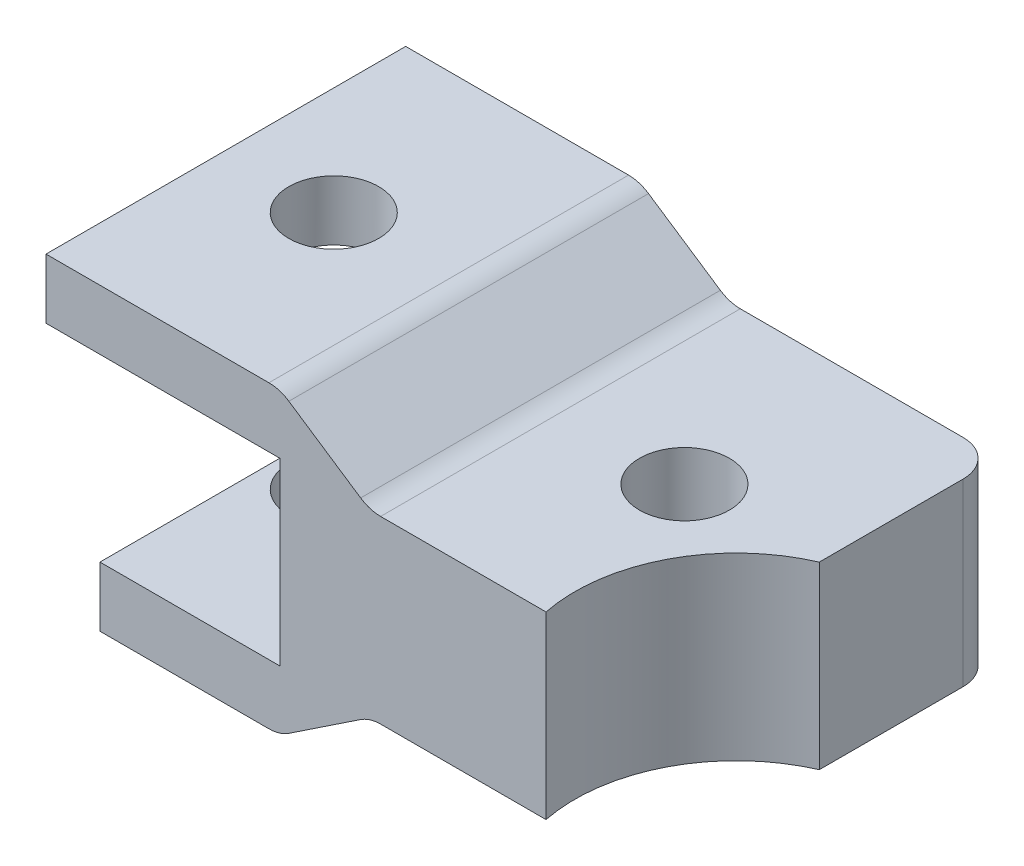
ISO-10303-21;
HEADER;
FILE_DESCRIPTION(('STEP AP214'),'2;1');
FILE_NAME('part.step','',(''),(''),'','','');
FILE_SCHEMA(('AUTOMOTIVE_DESIGN { 1 0 10303 214 1 1 1 1 }'));
ENDSEC;
DATA;
#1=APPLICATION_CONTEXT('core data for automotive mechanical design processes');
#2=APPLICATION_PROTOCOL_DEFINITION('international standard','automotive_design',2000,#1);
#3=PRODUCT_CONTEXT('',#1,'mechanical');
#4=PRODUCT('Part','Part','',(#3));
#5=PRODUCT_RELATED_PRODUCT_CATEGORY('part','',(#4));
#6=PRODUCT_DEFINITION_FORMATION('','',#4);
#7=PRODUCT_DEFINITION_CONTEXT('part definition',#1,'design');
#8=PRODUCT_DEFINITION('design','',#6,#7);
#9=PRODUCT_DEFINITION_SHAPE('','',#8);
#10=(LENGTH_UNIT() NAMED_UNIT(*) SI_UNIT(.MILLI.,.METRE.));
#11=(NAMED_UNIT(*) PLANE_ANGLE_UNIT() SI_UNIT($,.RADIAN.));
#12=(NAMED_UNIT(*) SI_UNIT($,.STERADIAN.) SOLID_ANGLE_UNIT());
#13=UNCERTAINTY_MEASURE_WITH_UNIT(LENGTH_MEASURE(1.E-05),#10,'distance_accuracy_value','');
#14=(GEOMETRIC_REPRESENTATION_CONTEXT(3) GLOBAL_UNCERTAINTY_ASSIGNED_CONTEXT((#13)) GLOBAL_UNIT_ASSIGNED_CONTEXT((#10,
#11,#12)) REPRESENTATION_CONTEXT('',''));
#15=CARTESIAN_POINT('',(0.,0.,0.));
#16=DIRECTION('',(0.,0.,1.));
#17=DIRECTION('',(1.,0.,0.));
#18=AXIS2_PLACEMENT_3D('',#15,#16,#17);
#19=CARTESIAN_POINT('',(5.85829192129549,-8.79095426364869,25.4));
#20=DIRECTION('',(-0.554546558579448,0.832152698948751,0.));
#21=DIRECTION('',(-0.832152698948751,-0.554546558579448,0.));
#22=AXIS2_PLACEMENT_3D('',#19,#20,#21);
#23=PLANE('',#22);
#24=DIRECTION('',(0.832152698948751,0.554546558579448,0.));
#25=VECTOR('',#24,1.);
#26=CARTESIAN_POINT('',(5.85829192129549,-8.79095426364869,0.));
#27=LINE('',#26,#25);
#28=CARTESIAN_POINT('',(13.3397541186527,-3.80530785532983,0.));
#29=VERTEX_POINT('',#28);
#30=CARTESIAN_POINT('',(18.4102458813473,-0.426332144670171,0.));
#31=VERTEX_POINT('',#30);
#32=EDGE_CURVE('E356',#29,#31,#27,.T.);
#33=ORIENTED_EDGE('',*,*,#32,.T.);
#34=DIRECTION('',(0.,0.,-1.));
#35=VECTOR('',#34,1.);
#36=CARTESIAN_POINT('',(18.4102458813473,-0.426332144670173,25.4));
#37=LINE('',#36,#35);
#38=CARTESIAN_POINT('',(18.4102458813473,-0.426332144670171,25.4));
#39=VERTEX_POINT('',#38);
#40=EDGE_CURVE('E297',#31,#39,#37,.F.);
#41=ORIENTED_EDGE('',*,*,#40,.T.);
#42=DIRECTION('',(0.832152698948751,0.554546558579448,0.));
#43=VECTOR('',#42,1.);
#44=CARTESIAN_POINT('',(5.85829192129549,-8.79095426364869,25.4));
#45=LINE('',#44,#43);
#46=CARTESIAN_POINT('',(13.3397541186527,-3.80530785532983,25.4));
#47=VERTEX_POINT('',#46);
#48=EDGE_CURVE('E390',#47,#39,#45,.T.);
#49=ORIENTED_EDGE('',*,*,#48,.F.);
#50=DIRECTION('',(0.,0.,-1.));
#51=VECTOR('',#50,1.);
#52=CARTESIAN_POINT('',(13.3397541186527,-3.80530785532983,25.4));
#53=LINE('',#52,#51);
#54=EDGE_CURVE('E294',#47,#29,#53,.T.);
#55=ORIENTED_EDGE('',*,*,#54,.T.);
#56=EDGE_LOOP('',(#33,#41,#49,#55));
#57=FACE_BOUND('',#56,.T.);
#58=ADVANCED_FACE('F86',(#57),#23,.F.);
#59=CARTESIAN_POINT('',(0.,0.,25.4));
#60=DIRECTION('',(0.,1.,0.));
#61=DIRECTION('',(0.,0.,1.));
#62=AXIS2_PLACEMENT_3D('',#59,#60,#61);
#63=PLANE('',#62);
#64=CARTESIAN_POINT('',(28.575,0.,12.7));
#65=DIRECTION('',(0.,1.,0.));
#66=DIRECTION('',(0.,0.,1.));
#67=AXIS2_PLACEMENT_3D('',#64,#65,#66);
#68=CIRCLE('',#67,3.175);
#69=CARTESIAN_POINT('',(28.575,0.,15.875));
#70=VERTEX_POINT('',#69);
#71=EDGE_CURVE('E276',#70,#70,#68,.T.);
#72=ORIENTED_EDGE('',*,*,#71,.T.);
#73=EDGE_LOOP('',(#72));
#74=FACE_BOUND('',#73,.T.);
#75=DIRECTION('',(1.,0.,0.));
#76=VECTOR('',#75,1.);
#77=CARTESIAN_POINT('',(0.,0.,0.));
#78=LINE('',#77,#76);
#79=CARTESIAN_POINT('',(19.8187941401391,0.,0.));
#80=VERTEX_POINT('',#79);
#81=CARTESIAN_POINT('',(35.56,0.,0.));
#82=VERTEX_POINT('',#81);
#83=EDGE_CURVE('E330',#80,#82,#78,.T.);
#84=ORIENTED_EDGE('',*,*,#83,.T.);
#85=CARTESIAN_POINT('',(35.56,0.,2.54));
#86=DIRECTION('',(0.,1.,0.));
#87=DIRECTION('',(0.,0.,1.));
#88=AXIS2_PLACEMENT_3D('',#85,#86,#87);
#89=CIRCLE('',#88,2.54);
#90=CARTESIAN_POINT('',(38.1,0.,2.54));
#91=VERTEX_POINT('',#90);
#92=EDGE_CURVE('E240',#82,#91,#89,.F.);
#93=ORIENTED_EDGE('',*,*,#92,.T.);
#94=DIRECTION('',(0.,0.,-1.));
#95=VECTOR('',#94,1.);
#96=CARTESIAN_POINT('',(38.1,0.,25.4));
#97=LINE('',#96,#95);
#98=CARTESIAN_POINT('',(38.1,0.,12.7));
#99=VERTEX_POINT('',#98);
#100=EDGE_CURVE('E232',#99,#91,#97,.T.);
#101=ORIENTED_EDGE('',*,*,#100,.F.);
#102=CARTESIAN_POINT('',(42.6728306226393,0.,23.1411593188651));
#103=DIRECTION('',(0.,1.,0.));
#104=DIRECTION('',(0.,0.,1.));
#105=AXIS2_PLACEMENT_3D('',#102,#103,#104);
#106=CIRCLE('',#105,11.3986221897768);
#107=CARTESIAN_POINT('',(31.5002648205274,0.,25.4));
#108=VERTEX_POINT('',#107);
#109=EDGE_CURVE('E213',#99,#108,#106,.T.);
#110=ORIENTED_EDGE('',*,*,#109,.T.);
#111=DIRECTION('',(1.,0.,0.));
#112=VECTOR('',#111,1.);
#113=CARTESIAN_POINT('',(0.,0.,25.4));
#114=LINE('',#113,#112);
#115=CARTESIAN_POINT('',(19.8187941401391,0.,25.4));
#116=VERTEX_POINT('',#115);
#117=EDGE_CURVE('E346',#116,#108,#114,.T.);
#118=ORIENTED_EDGE('',*,*,#117,.F.);
#119=DIRECTION('',(0.,0.,-1.));
#120=VECTOR('',#119,1.);
#121=CARTESIAN_POINT('',(19.8187941401391,0.,0.));
#122=LINE('',#121,#120);
#123=EDGE_CURVE('E290',#116,#80,#122,.T.);
#124=ORIENTED_EDGE('',*,*,#123,.T.);
#125=EDGE_LOOP('',(#84,#93,#101,#110,#118,#124));
#126=FACE_BOUND('',#125,.T.);
#127=ADVANCED_FACE('F238',(#74,#126),#63,.F.);
#128=CARTESIAN_POINT('',(38.1,0.,25.4));
#129=DIRECTION('',(-1.,0.,0.));
#130=DIRECTION('',(0.,0.,1.));
#131=AXIS2_PLACEMENT_3D('',#128,#129,#130);
#132=PLANE('',#131);
#133=ORIENTED_EDGE('',*,*,#100,.T.);
#134=DIRECTION('',(0.,1.,0.));
#135=VECTOR('',#134,1.);
#136=CARTESIAN_POINT('',(38.1,0.,2.54));
#137=LINE('',#136,#135);
#138=CARTESIAN_POINT('',(38.1,12.7,2.54));
#139=VERTEX_POINT('',#138);
#140=EDGE_CURVE('E278',#91,#139,#137,.T.);
#141=ORIENTED_EDGE('',*,*,#140,.T.);
#142=DIRECTION('',(0.,0.,-1.));
#143=VECTOR('',#142,1.);
#144=CARTESIAN_POINT('',(38.1,12.7,25.4));
#145=LINE('',#144,#143);
#146=CARTESIAN_POINT('',(38.1,12.7,12.7));
#147=VERTEX_POINT('',#146);
#148=EDGE_CURVE('E235',#147,#139,#145,.T.);
#149=ORIENTED_EDGE('',*,*,#148,.F.);
#150=DIRECTION('',(0.,1.,0.));
#151=VECTOR('',#150,1.);
#152=CARTESIAN_POINT('',(38.1,-4.23164,12.7));
#153=LINE('',#152,#151);
#154=EDGE_CURVE('E217',#99,#147,#153,.T.);
#155=ORIENTED_EDGE('',*,*,#154,.F.);
#156=EDGE_LOOP('',(#133,#141,#149,#155));
#157=FACE_BOUND('',#156,.T.);
#158=ADVANCED_FACE('F230',(#157),#132,.F.);
#159=CARTESIAN_POINT('',(0.,12.7,25.4));
#160=DIRECTION('',(0.,1.,0.));
#161=DIRECTION('',(0.,0.,1.));
#162=AXIS2_PLACEMENT_3D('',#159,#160,#161);
#163=PLANE('',#162);
#164=ORIENTED_EDGE('',*,*,#148,.T.);
#165=CARTESIAN_POINT('',(35.56,12.7,2.54));
#166=DIRECTION('',(0.,1.,0.));
#167=DIRECTION('',(0.,0.,1.));
#168=AXIS2_PLACEMENT_3D('',#165,#166,#167);
#169=CIRCLE('',#168,2.54);
#170=CARTESIAN_POINT('',(35.56,12.7,0.));
#171=VERTEX_POINT('',#170);
#172=EDGE_CURVE('E282',#139,#171,#169,.T.);
#173=ORIENTED_EDGE('',*,*,#172,.T.);
#174=DIRECTION('',(1.,0.,0.));
#175=VECTOR('',#174,1.);
#176=CARTESIAN_POINT('',(0.,12.7,0.));
#177=LINE('',#176,#175);
#178=CARTESIAN_POINT('',(19.8187941401391,12.7,0.));
#179=VERTEX_POINT('',#178);
#180=EDGE_CURVE('E319',#179,#171,#177,.T.);
#181=ORIENTED_EDGE('',*,*,#180,.F.);
#182=DIRECTION('',(0.,0.,-1.));
#183=VECTOR('',#182,1.);
#184=CARTESIAN_POINT('',(19.8187941401391,12.7,25.4));
#185=LINE('',#184,#183);
#186=CARTESIAN_POINT('',(19.8187941401391,12.7,25.4));
#187=VERTEX_POINT('',#186);
#188=EDGE_CURVE('E280',#179,#187,#185,.F.);
#189=ORIENTED_EDGE('',*,*,#188,.T.);
#190=DIRECTION('',(1.,0.,0.));
#191=VECTOR('',#190,1.);
#192=CARTESIAN_POINT('',(0.,12.7,25.4));
#193=LINE('',#192,#191);
#194=CARTESIAN_POINT('',(31.5002648205274,12.7,25.4));
#195=VERTEX_POINT('',#194);
#196=EDGE_CURVE('E337',#187,#195,#193,.T.);
#197=ORIENTED_EDGE('',*,*,#196,.T.);
#198=CARTESIAN_POINT('',(42.6728306226393,12.7,23.1411593188651));
#199=DIRECTION('',(0.,1.,0.));
#200=DIRECTION('',(0.,0.,1.));
#201=AXIS2_PLACEMENT_3D('',#198,#199,#200);
#202=CIRCLE('',#201,11.3986221897768);
#203=EDGE_CURVE('E225',#147,#195,#202,.T.);
#204=ORIENTED_EDGE('',*,*,#203,.F.);
#205=EDGE_LOOP('',(#164,#173,#181,#189,#197,#204));
#206=FACE_BOUND('',#205,.T.);
#207=CARTESIAN_POINT('',(28.575,12.7,12.7));
#208=DIRECTION('',(0.,1.,0.));
#209=DIRECTION('',(0.,0.,1.));
#210=AXIS2_PLACEMENT_3D('',#207,#208,#209);
#211=CIRCLE('',#210,3.175);
#212=CARTESIAN_POINT('',(28.575,12.7,15.875));
#213=VERTEX_POINT('',#212);
#214=EDGE_CURVE('E224',#213,#213,#211,.T.);
#215=ORIENTED_EDGE('',*,*,#214,.F.);
#216=EDGE_LOOP('',(#215));
#217=FACE_BOUND('',#216,.T.);
#218=ADVANCED_FACE('F327',(#206,#217),#163,.T.);
#219=CARTESIAN_POINT('',(11.7189280970613,17.5854263161184,25.4));
#220=DIRECTION('',(0.554546558579448,0.832152698948751,0.));
#221=DIRECTION('',(-0.832152698948751,0.554546558579448,0.));
#222=AXIS2_PLACEMENT_3D('',#219,#220,#221);
#223=PLANE('',#222);
#224=DIRECTION('',(0.832152698948751,-0.554546558579448,0.));
#225=VECTOR('',#224,1.);
#226=CARTESIAN_POINT('',(11.7189280970613,17.5854263161184,25.4));
#227=LINE('',#226,#225);
#228=CARTESIAN_POINT('',(13.3397541186527,16.5053078553298,25.4));
#229=VERTEX_POINT('',#228);
#230=CARTESIAN_POINT('',(18.4102458813473,13.1263321446702,25.4));
#231=VERTEX_POINT('',#230);
#232=EDGE_CURVE('E336',#229,#231,#227,.T.);
#233=ORIENTED_EDGE('',*,*,#232,.T.);
#234=DIRECTION('',(0.,0.,-1.));
#235=VECTOR('',#234,1.);
#236=CARTESIAN_POINT('',(18.4102458813473,13.1263321446702,0.));
#237=LINE('',#236,#235);
#238=CARTESIAN_POINT('',(18.4102458813473,13.1263321446702,0.));
#239=VERTEX_POINT('',#238);
#240=EDGE_CURVE('E301',#231,#239,#237,.T.);
#241=ORIENTED_EDGE('',*,*,#240,.T.);
#242=DIRECTION('',(0.832152698948751,-0.554546558579448,0.));
#243=VECTOR('',#242,1.);
#244=CARTESIAN_POINT('',(11.7189280970613,17.5854263161184,0.));
#245=LINE('',#244,#243);
#246=CARTESIAN_POINT('',(13.3397541186527,16.5053078553298,0.));
#247=VERTEX_POINT('',#246);
#248=EDGE_CURVE('E322',#247,#239,#245,.T.);
#249=ORIENTED_EDGE('',*,*,#248,.F.);
#250=DIRECTION('',(0.,0.,-1.));
#251=VECTOR('',#250,1.);
#252=CARTESIAN_POINT('',(13.3397541186527,16.5053078553298,25.4));
#253=LINE('',#252,#251);
#254=EDGE_CURVE('E299',#247,#229,#253,.F.);
#255=ORIENTED_EDGE('',*,*,#254,.T.);
#256=EDGE_LOOP('',(#233,#241,#249,#255));
#257=FACE_BOUND('',#256,.T.);
#258=ADVANCED_FACE('F339',(#257),#223,.T.);
#259=CARTESIAN_POINT('',(12.7,0.,25.4));
#260=DIRECTION('',(-1.,0.,0.));
#261=DIRECTION('',(0.,0.,1.));
#262=AXIS2_PLACEMENT_3D('',#259,#260,#261);
#263=PLANE('',#262);
#264=DIRECTION('',(0.,0.,1.));
#265=VECTOR('',#264,1.);
#266=CARTESIAN_POINT('',(12.7,12.7,25.4));
#267=LINE('',#266,#265);
#268=CARTESIAN_POINT('',(12.7,12.7,0.));
#269=VERTEX_POINT('',#268);
#270=CARTESIAN_POINT('',(12.7,12.7,25.4));
#271=VERTEX_POINT('',#270);
#272=EDGE_CURVE('E241',#269,#271,#267,.T.);
#273=ORIENTED_EDGE('',*,*,#272,.F.);
#274=DIRECTION('',(0.,1.,0.));
#275=VECTOR('',#274,1.);
#276=CARTESIAN_POINT('',(12.7,0.,0.));
#277=LINE('',#276,#275);
#278=CARTESIAN_POINT('',(12.7,0.,0.));
#279=VERTEX_POINT('',#278);
#280=EDGE_CURVE('E361',#279,#269,#277,.T.);
#281=ORIENTED_EDGE('',*,*,#280,.F.);
#282=DIRECTION('',(0.,0.,-1.));
#283=VECTOR('',#282,1.);
#284=CARTESIAN_POINT('',(12.7,0.,25.4));
#285=LINE('',#284,#283);
#286=CARTESIAN_POINT('',(12.7,0.,25.4));
#287=VERTEX_POINT('',#286);
#288=EDGE_CURVE('E244',#287,#279,#285,.T.);
#289=ORIENTED_EDGE('',*,*,#288,.F.);
#290=DIRECTION('',(0.,1.,0.));
#291=VECTOR('',#290,1.);
#292=CARTESIAN_POINT('',(12.7,0.,25.4));
#293=LINE('',#292,#291);
#294=EDGE_CURVE('E341',#287,#271,#293,.T.);
#295=ORIENTED_EDGE('',*,*,#294,.T.);
#296=EDGE_LOOP('',(#273,#281,#289,#295));
#297=FACE_BOUND('',#296,.T.);
#298=ADVANCED_FACE('F380',(#297),#263,.T.);
#299=CARTESIAN_POINT('',(0.,0.,25.4));
#300=DIRECTION('',(0.,1.,0.));
#301=DIRECTION('',(0.,0.,1.));
#302=AXIS2_PLACEMENT_3D('',#299,#300,#301);
#303=PLANE('',#302);
#304=CARTESIAN_POINT('',(3.8099999999996,0.,12.7000000000001));
#305=DIRECTION('',(0.,1.,0.));
#306=DIRECTION('',(0.,0.,1.));
#307=AXIS2_PLACEMENT_3D('',#304,#305,#306);
#308=CIRCLE('',#307,3.175);
#309=CARTESIAN_POINT('',(3.8099999999996,0.,15.8750000000001));
#310=VERTEX_POINT('',#309);
#311=EDGE_CURVE('E261',#310,#310,#308,.T.);
#312=ORIENTED_EDGE('',*,*,#311,.F.);
#313=EDGE_LOOP('',(#312));
#314=FACE_BOUND('',#313,.T.);
#315=DIRECTION('',(1.,0.,0.));
#316=VECTOR('',#315,1.);
#317=CARTESIAN_POINT('',(0.,0.,0.));
#318=LINE('',#317,#316);
#319=CARTESIAN_POINT('',(0.,0.,0.));
#320=VERTEX_POINT('',#319);
#321=EDGE_CURVE('E364',#320,#279,#318,.T.);
#322=ORIENTED_EDGE('',*,*,#321,.F.);
#323=DIRECTION('',(0.,0.,-1.));
#324=VECTOR('',#323,1.);
#325=CARTESIAN_POINT('',(0.,0.,25.4));
#326=LINE('',#325,#324);
#327=CARTESIAN_POINT('',(0.,0.,25.4));
#328=VERTEX_POINT('',#327);
#329=EDGE_CURVE('E372',#328,#320,#326,.T.);
#330=ORIENTED_EDGE('',*,*,#329,.F.);
#331=DIRECTION('',(1.,0.,0.));
#332=VECTOR('',#331,1.);
#333=CARTESIAN_POINT('',(0.,0.,25.4));
#334=LINE('',#333,#332);
#335=EDGE_CURVE('E344',#328,#287,#334,.T.);
#336=ORIENTED_EDGE('',*,*,#335,.T.);
#337=ORIENTED_EDGE('',*,*,#288,.T.);
#338=EDGE_LOOP('',(#322,#330,#336,#337));
#339=FACE_BOUND('',#338,.T.);
#340=ADVANCED_FACE('F376',(#314,#339),#303,.T.);
#341=CARTESIAN_POINT('',(0.,0.,25.4));
#342=DIRECTION('',(1.,0.,0.));
#343=DIRECTION('',(0.,0.,-1.));
#344=AXIS2_PLACEMENT_3D('',#341,#342,#343);
#345=PLANE('',#344);
#346=DIRECTION('',(0.,-1.,0.));
#347=VECTOR('',#346,1.);
#348=CARTESIAN_POINT('',(0.,0.,0.));
#349=LINE('',#348,#347);
#350=CARTESIAN_POINT('',(0.,-4.23164,0.));
#351=VERTEX_POINT('',#350);
#352=EDGE_CURVE('E367',#320,#351,#349,.T.);
#353=ORIENTED_EDGE('',*,*,#352,.T.);
#354=DIRECTION('',(0.,0.,-1.));
#355=VECTOR('',#354,1.);
#356=CARTESIAN_POINT('',(0.,-4.23164,25.4));
#357=LINE('',#356,#355);
#358=CARTESIAN_POINT('',(0.,-4.23164,25.4));
#359=VERTEX_POINT('',#358);
#360=EDGE_CURVE('E354',#359,#351,#357,.T.);
#361=ORIENTED_EDGE('',*,*,#360,.F.);
#362=DIRECTION('',(0.,-1.,0.));
#363=VECTOR('',#362,1.);
#364=CARTESIAN_POINT('',(0.,0.,25.4));
#365=LINE('',#364,#363);
#366=EDGE_CURVE('E352',#328,#359,#365,.T.);
#367=ORIENTED_EDGE('',*,*,#366,.F.);
#368=ORIENTED_EDGE('',*,*,#329,.T.);
#369=EDGE_LOOP('',(#353,#361,#367,#368));
#370=FACE_BOUND('',#369,.T.);
#371=ADVANCED_FACE('F386',(#370),#345,.F.);
#372=CARTESIAN_POINT('',(0.,-4.23164,25.4));
#373=DIRECTION('',(0.,1.,0.));
#374=DIRECTION('',(0.,0.,1.));
#375=AXIS2_PLACEMENT_3D('',#372,#373,#374);
#376=PLANE('',#375);
#377=CARTESIAN_POINT('',(3.8099999999996,-4.23164,12.7000000000001));
#378=DIRECTION('',(0.,1.,0.));
#379=DIRECTION('',(0.,0.,1.));
#380=AXIS2_PLACEMENT_3D('',#377,#378,#379);
#381=CIRCLE('',#380,3.175);
#382=CARTESIAN_POINT('',(3.8099999999996,-4.23164,15.8750000000001));
#383=VERTEX_POINT('',#382);
#384=EDGE_CURVE('E273',#383,#383,#381,.T.);
#385=ORIENTED_EDGE('',*,*,#384,.T.);
#386=EDGE_LOOP('',(#385));
#387=FACE_BOUND('',#386,.T.);
#388=DIRECTION('',(1.,0.,0.));
#389=VECTOR('',#388,1.);
#390=CARTESIAN_POINT('',(0.,-4.23164,0.));
#391=LINE('',#390,#389);
#392=CARTESIAN_POINT('',(11.9312058598609,-4.23164,0.));
#393=VERTEX_POINT('',#392);
#394=EDGE_CURVE('E268',#351,#393,#391,.T.);
#395=ORIENTED_EDGE('',*,*,#394,.T.);
#396=DIRECTION('',(0.,0.,-1.));
#397=VECTOR('',#396,1.);
#398=CARTESIAN_POINT('',(11.9312058598609,-4.23164,25.4));
#399=LINE('',#398,#397);
#400=CARTESIAN_POINT('',(11.9312058598609,-4.23164,25.4));
#401=VERTEX_POINT('',#400);
#402=EDGE_CURVE('E101',#393,#401,#399,.F.);
#403=ORIENTED_EDGE('',*,*,#402,.T.);
#404=DIRECTION('',(1.,0.,0.));
#405=VECTOR('',#404,1.);
#406=CARTESIAN_POINT('',(0.,-4.23164,25.4));
#407=LINE('',#406,#405);
#408=EDGE_CURVE('E369',#359,#401,#407,.T.);
#409=ORIENTED_EDGE('',*,*,#408,.F.);
#410=ORIENTED_EDGE('',*,*,#360,.T.);
#411=EDGE_LOOP('',(#395,#403,#409,#410));
#412=FACE_BOUND('',#411,.T.);
#413=ADVANCED_FACE('F388',(#387,#412),#376,.F.);
#414=CARTESIAN_POINT('',(0.,0.,0.));
#415=DIRECTION('',(0.,0.,1.));
#416=DIRECTION('',(1.,0.,0.));
#417=AXIS2_PLACEMENT_3D('',#414,#415,#416);
#418=PLANE('',#417);
#419=ORIENTED_EDGE('',*,*,#180,.T.);
#420=DIRECTION('',(0.,1.,0.));
#421=VECTOR('',#420,1.);
#422=CARTESIAN_POINT('',(35.56,0.,0.));
#423=LINE('',#422,#421);
#424=EDGE_CURVE('E288',#171,#82,#423,.F.);
#425=ORIENTED_EDGE('',*,*,#424,.T.);
#426=ORIENTED_EDGE('',*,*,#83,.F.);
#427=CARTESIAN_POINT('',(19.8187941401391,-2.54,0.));
#428=DIRECTION('',(0.,0.,1.));
#429=DIRECTION('',(1.,0.,0.));
#430=AXIS2_PLACEMENT_3D('',#427,#428,#429);
#431=CIRCLE('',#430,2.54);
#432=EDGE_CURVE('E311',#80,#31,#431,.T.);
#433=ORIENTED_EDGE('',*,*,#432,.T.);
#434=ORIENTED_EDGE('',*,*,#32,.F.);
#435=CARTESIAN_POINT('',(11.9312058598609,-1.69164,0.));
#436=DIRECTION('',(0.,0.,1.));
#437=DIRECTION('',(1.,0.,0.));
#438=AXIS2_PLACEMENT_3D('',#435,#436,#437);
#439=CIRCLE('',#438,2.54);
#440=EDGE_CURVE('E284',#29,#393,#439,.F.);
#441=ORIENTED_EDGE('',*,*,#440,.T.);
#442=ORIENTED_EDGE('',*,*,#394,.F.);
#443=ORIENTED_EDGE('',*,*,#352,.F.);
#444=ORIENTED_EDGE('',*,*,#321,.T.);
#445=ORIENTED_EDGE('',*,*,#280,.T.);
#446=DIRECTION('',(-1.,0.,0.));
#447=VECTOR('',#446,1.);
#448=CARTESIAN_POINT('',(12.7,12.7,0.));
#449=LINE('',#448,#447);
#450=CARTESIAN_POINT('',(-3.81000000000001,12.7,0.));
#451=VERTEX_POINT('',#450);
#452=EDGE_CURVE('E257',#269,#451,#449,.T.);
#453=ORIENTED_EDGE('',*,*,#452,.T.);
#454=DIRECTION('',(0.,-1.,0.));
#455=VECTOR('',#454,1.);
#456=CARTESIAN_POINT('',(-3.81000000000001,16.93164,0.));
#457=LINE('',#456,#455);
#458=CARTESIAN_POINT('',(-3.81000000000001,16.93164,0.));
#459=VERTEX_POINT('',#458);
#460=EDGE_CURVE('E260',#459,#451,#457,.T.);
#461=ORIENTED_EDGE('',*,*,#460,.F.);
#462=DIRECTION('',(-1.,0.,0.));
#463=VECTOR('',#462,1.);
#464=CARTESIAN_POINT('',(12.7,16.93164,0.));
#465=LINE('',#464,#463);
#466=CARTESIAN_POINT('',(11.9312058598609,16.93164,0.));
#467=VERTEX_POINT('',#466);
#468=EDGE_CURVE('E252',#467,#459,#465,.T.);
#469=ORIENTED_EDGE('',*,*,#468,.F.);
#470=CARTESIAN_POINT('',(11.9312058598609,14.39164,0.));
#471=DIRECTION('',(0.,0.,1.));
#472=DIRECTION('',(1.,0.,0.));
#473=AXIS2_PLACEMENT_3D('',#470,#471,#472);
#474=CIRCLE('',#473,2.54);
#475=EDGE_CURVE('E286',#467,#247,#474,.F.);
#476=ORIENTED_EDGE('',*,*,#475,.T.);
#477=ORIENTED_EDGE('',*,*,#248,.T.);
#478=CARTESIAN_POINT('',(19.8187941401391,15.24,0.));
#479=DIRECTION('',(0.,0.,1.));
#480=DIRECTION('',(1.,0.,0.));
#481=AXIS2_PLACEMENT_3D('',#478,#479,#480);
#482=CIRCLE('',#481,2.54);
#483=EDGE_CURVE('E94',#239,#179,#482,.T.);
#484=ORIENTED_EDGE('',*,*,#483,.T.);
#485=EDGE_LOOP('',(#419,#425,#426,#433,#434,#441,#442,#443,#444,#445,#453,#461,#469,#476,#477,#484));
#486=FACE_BOUND('',#485,.T.);
#487=ADVANCED_FACE('F318',(#486),#418,.F.);
#488=CARTESIAN_POINT('',(0.,0.,25.4));
#489=DIRECTION('',(0.,0.,1.));
#490=DIRECTION('',(1.,0.,0.));
#491=AXIS2_PLACEMENT_3D('',#488,#489,#490);
#492=PLANE('',#491);
#493=ORIENTED_EDGE('',*,*,#232,.F.);
#494=CARTESIAN_POINT('',(11.9312058598609,14.39164,25.4));
#495=DIRECTION('',(0.,0.,1.));
#496=DIRECTION('',(1.,0.,0.));
#497=AXIS2_PLACEMENT_3D('',#494,#495,#496);
#498=CIRCLE('',#497,2.54);
#499=CARTESIAN_POINT('',(11.9312058598609,16.93164,25.4));
#500=VERTEX_POINT('',#499);
#501=EDGE_CURVE('E109',#229,#500,#498,.T.);
#502=ORIENTED_EDGE('',*,*,#501,.T.);
#503=DIRECTION('',(-1.,0.,0.));
#504=VECTOR('',#503,1.);
#505=CARTESIAN_POINT('',(12.7,16.93164,25.4));
#506=LINE('',#505,#504);
#507=CARTESIAN_POINT('',(-3.81000000000001,16.93164,25.4));
#508=VERTEX_POINT('',#507);
#509=EDGE_CURVE('E254',#500,#508,#506,.T.);
#510=ORIENTED_EDGE('',*,*,#509,.T.);
#511=DIRECTION('',(0.,-1.,0.));
#512=VECTOR('',#511,1.);
#513=CARTESIAN_POINT('',(-3.81000000000001,16.93164,25.4));
#514=LINE('',#513,#512);
#515=CARTESIAN_POINT('',(-3.81000000000001,12.7,25.4));
#516=VERTEX_POINT('',#515);
#517=EDGE_CURVE('E251',#508,#516,#514,.T.);
#518=ORIENTED_EDGE('',*,*,#517,.T.);
#519=DIRECTION('',(-1.,0.,0.));
#520=VECTOR('',#519,1.);
#521=CARTESIAN_POINT('',(12.7,12.7,25.4));
#522=LINE('',#521,#520);
#523=EDGE_CURVE('E248',#271,#516,#522,.T.);
#524=ORIENTED_EDGE('',*,*,#523,.F.);
#525=ORIENTED_EDGE('',*,*,#294,.F.);
#526=ORIENTED_EDGE('',*,*,#335,.F.);
#527=ORIENTED_EDGE('',*,*,#366,.T.);
#528=ORIENTED_EDGE('',*,*,#408,.T.);
#529=CARTESIAN_POINT('',(11.9312058598609,-1.69164,25.4));
#530=DIRECTION('',(0.,0.,1.));
#531=DIRECTION('',(1.,0.,0.));
#532=AXIS2_PLACEMENT_3D('',#529,#530,#531);
#533=CIRCLE('',#532,2.54);
#534=EDGE_CURVE('E307',#401,#47,#533,.T.);
#535=ORIENTED_EDGE('',*,*,#534,.T.);
#536=ORIENTED_EDGE('',*,*,#48,.T.);
#537=CARTESIAN_POINT('',(19.8187941401391,-2.54,25.4));
#538=DIRECTION('',(0.,0.,1.));
#539=DIRECTION('',(1.,0.,0.));
#540=AXIS2_PLACEMENT_3D('',#537,#538,#539);
#541=CIRCLE('',#540,2.54);
#542=EDGE_CURVE('E313',#39,#116,#541,.F.);
#543=ORIENTED_EDGE('',*,*,#542,.T.);
#544=ORIENTED_EDGE('',*,*,#117,.T.);
#545=DIRECTION('',(0.,1.,0.));
#546=VECTOR('',#545,1.);
#547=CARTESIAN_POINT('',(31.5002648205274,-4.23164,25.4));
#548=LINE('',#547,#546);
#549=EDGE_CURVE('E220',#195,#108,#548,.F.);
#550=ORIENTED_EDGE('',*,*,#549,.F.);
#551=ORIENTED_EDGE('',*,*,#196,.F.);
#552=CARTESIAN_POINT('',(19.8187941401391,15.24,25.4));
#553=DIRECTION('',(0.,0.,1.));
#554=DIRECTION('',(1.,0.,0.));
#555=AXIS2_PLACEMENT_3D('',#552,#553,#554);
#556=CIRCLE('',#555,2.54);
#557=EDGE_CURVE('E12',#187,#231,#556,.F.);
#558=ORIENTED_EDGE('',*,*,#557,.T.);
#559=EDGE_LOOP('',(#493,#502,#510,#518,#524,#525,#526,#527,#528,#535,#536,#543,#544,#550,#551,#558));
#560=FACE_BOUND('',#559,.T.);
#561=ADVANCED_FACE('F335',(#560),#492,.T.);
#562=CARTESIAN_POINT('',(12.7,16.93164,25.4));
#563=DIRECTION('',(0.,-1.,0.));
#564=DIRECTION('',(0.,0.,-1.));
#565=AXIS2_PLACEMENT_3D('',#562,#563,#564);
#566=PLANE('',#565);
#567=CARTESIAN_POINT('',(3.8099999999996,16.93164,12.7000000000001));
#568=DIRECTION('',(0.,1.,0.));
#569=DIRECTION('',(0.,0.,1.));
#570=AXIS2_PLACEMENT_3D('',#567,#568,#569);
#571=CIRCLE('',#570,3.175);
#572=CARTESIAN_POINT('',(3.8099999999996,16.93164,15.8750000000001));
#573=VERTEX_POINT('',#572);
#574=EDGE_CURVE('E624',#573,#573,#571,.T.);
#575=ORIENTED_EDGE('',*,*,#574,.F.);
#576=EDGE_LOOP('',(#575));
#577=FACE_BOUND('',#576,.T.);
#578=ORIENTED_EDGE('',*,*,#509,.F.);
#579=DIRECTION('',(0.,0.,-1.));
#580=VECTOR('',#579,1.);
#581=CARTESIAN_POINT('',(11.9312058598609,16.93164,0.));
#582=LINE('',#581,#580);
#583=EDGE_CURVE('E304',#500,#467,#582,.T.);
#584=ORIENTED_EDGE('',*,*,#583,.T.);
#585=ORIENTED_EDGE('',*,*,#468,.T.);
#586=DIRECTION('',(0.,0.,-1.));
#587=VECTOR('',#586,1.);
#588=CARTESIAN_POINT('',(-3.81000000000001,16.93164,25.4));
#589=LINE('',#588,#587);
#590=EDGE_CURVE('E265',#508,#459,#589,.T.);
#591=ORIENTED_EDGE('',*,*,#590,.F.);
#592=EDGE_LOOP('',(#578,#584,#585,#591));
#593=FACE_BOUND('',#592,.T.);
#594=ADVANCED_FACE('F426',(#577,#593),#566,.F.);
#595=CARTESIAN_POINT('',(-3.81000000000001,16.93164,25.4));
#596=DIRECTION('',(1.,0.,0.));
#597=DIRECTION('',(0.,1.,0.));
#598=AXIS2_PLACEMENT_3D('',#595,#596,#597);
#599=PLANE('',#598);
#600=ORIENTED_EDGE('',*,*,#460,.T.);
#601=DIRECTION('',(0.,0.,-1.));
#602=VECTOR('',#601,1.);
#603=CARTESIAN_POINT('',(-3.81000000000001,12.7,25.4));
#604=LINE('',#603,#602);
#605=EDGE_CURVE('E256',#516,#451,#604,.T.);
#606=ORIENTED_EDGE('',*,*,#605,.F.);
#607=ORIENTED_EDGE('',*,*,#517,.F.);
#608=ORIENTED_EDGE('',*,*,#590,.T.);
#609=EDGE_LOOP('',(#600,#606,#607,#608));
#610=FACE_BOUND('',#609,.T.);
#611=ADVANCED_FACE('F429',(#610),#599,.F.);
#612=CARTESIAN_POINT('',(12.7,12.7,25.4));
#613=DIRECTION('',(0.,-1.,0.));
#614=DIRECTION('',(0.,0.,-1.));
#615=AXIS2_PLACEMENT_3D('',#612,#613,#614);
#616=PLANE('',#615);
#617=CARTESIAN_POINT('',(3.8099999999996,12.7,12.7000000000001));
#618=DIRECTION('',(0.,-1.,0.));
#619=DIRECTION('',(0.,0.,-1.));
#620=AXIS2_PLACEMENT_3D('',#617,#618,#619);
#621=CIRCLE('',#620,3.175);
#622=CARTESIAN_POINT('',(3.8099999999996,12.7,9.52500000000006));
#623=VERTEX_POINT('',#622);
#624=EDGE_CURVE('E270',#623,#623,#621,.T.);
#625=ORIENTED_EDGE('',*,*,#624,.F.);
#626=EDGE_LOOP('',(#625));
#627=FACE_BOUND('',#626,.T.);
#628=ORIENTED_EDGE('',*,*,#452,.F.);
#629=ORIENTED_EDGE('',*,*,#272,.T.);
#630=ORIENTED_EDGE('',*,*,#523,.T.);
#631=ORIENTED_EDGE('',*,*,#605,.T.);
#632=EDGE_LOOP('',(#628,#629,#630,#631));
#633=FACE_BOUND('',#632,.T.);
#634=ADVANCED_FACE('F433',(#627,#633),#616,.T.);
#635=CARTESIAN_POINT('',(3.8099999999996,-4.23164,12.7000000000001));
#636=DIRECTION('',(0.,1.,0.));
#637=DIRECTION('',(0.,0.,1.));
#638=AXIS2_PLACEMENT_3D('',#635,#636,#637);
#639=CYLINDRICAL_SURFACE('',#638,3.175);
#640=ORIENTED_EDGE('',*,*,#624,.T.);
#641=EDGE_LOOP('',(#640));
#642=FACE_BOUND('',#641,.T.);
#643=ORIENTED_EDGE('',*,*,#574,.T.);
#644=EDGE_LOOP('',(#643));
#645=FACE_BOUND('',#644,.T.);
#646=ADVANCED_FACE('F437',(#642,#645),#639,.F.);
#647=ORIENTED_EDGE('',*,*,#311,.T.);
#648=EDGE_LOOP('',(#647));
#649=FACE_BOUND('',#648,.T.);
#650=ORIENTED_EDGE('',*,*,#384,.F.);
#651=EDGE_LOOP('',(#650));
#652=FACE_BOUND('',#651,.T.);
#653=ADVANCED_FACE('F485',(#649,#652),#639,.F.);
#654=CARTESIAN_POINT('',(28.575,-4.23164,12.7));
#655=DIRECTION('',(0.,1.,0.));
#656=DIRECTION('',(0.,0.,1.));
#657=AXIS2_PLACEMENT_3D('',#654,#655,#656);
#658=CYLINDRICAL_SURFACE('',#657,3.175);
#659=ORIENTED_EDGE('',*,*,#214,.T.);
#660=EDGE_LOOP('',(#659));
#661=FACE_BOUND('',#660,.T.);
#662=ORIENTED_EDGE('',*,*,#71,.F.);
#663=EDGE_LOOP('',(#662));
#664=FACE_BOUND('',#663,.T.);
#665=ADVANCED_FACE('F477',(#661,#664),#658,.F.);
#666=CARTESIAN_POINT('',(42.6728306226393,-4.23164,23.1411593188651));
#667=DIRECTION('',(0.,1.,0.));
#668=DIRECTION('',(0.,0.,1.));
#669=AXIS2_PLACEMENT_3D('',#666,#667,#668);
#670=CYLINDRICAL_SURFACE('',#669,11.3986221897768);
#671=ORIENTED_EDGE('',*,*,#154,.T.);
#672=ORIENTED_EDGE('',*,*,#203,.T.);
#673=ORIENTED_EDGE('',*,*,#549,.T.);
#674=ORIENTED_EDGE('',*,*,#109,.F.);
#675=EDGE_LOOP('',(#671,#672,#673,#674));
#676=FACE_BOUND('',#675,.T.);
#677=ADVANCED_FACE('F215',(#676),#670,.F.);
#678=CARTESIAN_POINT('',(35.56,0.,2.54));
#679=DIRECTION('',(0.,1.,0.));
#680=DIRECTION('',(0.,0.,1.));
#681=AXIS2_PLACEMENT_3D('',#678,#679,#680);
#682=CYLINDRICAL_SURFACE('',#681,2.54);
#683=ORIENTED_EDGE('',*,*,#92,.F.);
#684=ORIENTED_EDGE('',*,*,#424,.F.);
#685=ORIENTED_EDGE('',*,*,#172,.F.);
#686=ORIENTED_EDGE('',*,*,#140,.F.);
#687=EDGE_LOOP('',(#683,#684,#685,#686));
#688=FACE_BOUND('',#687,.T.);
#689=ADVANCED_FACE('F439',(#688),#682,.T.);
#690=CARTESIAN_POINT('',(19.8187941401391,-2.54,25.4));
#691=DIRECTION('',(0.,0.,1.));
#692=DIRECTION('',(1.,0.,0.));
#693=AXIS2_PLACEMENT_3D('',#690,#691,#692);
#694=CYLINDRICAL_SURFACE('',#693,2.54);
#695=ORIENTED_EDGE('',*,*,#542,.F.);
#696=ORIENTED_EDGE('',*,*,#40,.F.);
#697=ORIENTED_EDGE('',*,*,#432,.F.);
#698=ORIENTED_EDGE('',*,*,#123,.F.);
#699=EDGE_LOOP('',(#695,#696,#697,#698));
#700=FACE_BOUND('',#699,.T.);
#701=ADVANCED_FACE('F400',(#700),#694,.F.);
#702=CARTESIAN_POINT('',(19.8187941401391,15.24,25.4));
#703=DIRECTION('',(0.,0.,1.));
#704=DIRECTION('',(1.,0.,0.));
#705=AXIS2_PLACEMENT_3D('',#702,#703,#704);
#706=CYLINDRICAL_SURFACE('',#705,2.54);
#707=ORIENTED_EDGE('',*,*,#557,.F.);
#708=ORIENTED_EDGE('',*,*,#188,.F.);
#709=ORIENTED_EDGE('',*,*,#483,.F.);
#710=ORIENTED_EDGE('',*,*,#240,.F.);
#711=EDGE_LOOP('',(#707,#708,#709,#710));
#712=FACE_BOUND('',#711,.T.);
#713=ADVANCED_FACE('F333',(#712),#706,.F.);
#714=CARTESIAN_POINT('',(11.9312058598609,14.39164,25.4));
#715=DIRECTION('',(0.,0.,1.));
#716=DIRECTION('',(1.,0.,0.));
#717=AXIS2_PLACEMENT_3D('',#714,#715,#716);
#718=CYLINDRICAL_SURFACE('',#717,2.54);
#719=ORIENTED_EDGE('',*,*,#501,.F.);
#720=ORIENTED_EDGE('',*,*,#254,.F.);
#721=ORIENTED_EDGE('',*,*,#475,.F.);
#722=ORIENTED_EDGE('',*,*,#583,.F.);
#723=EDGE_LOOP('',(#719,#720,#721,#722));
#724=FACE_BOUND('',#723,.T.);
#725=ADVANCED_FACE('F408',(#724),#718,.T.);
#726=CARTESIAN_POINT('',(11.9312058598609,-1.69164,25.4));
#727=DIRECTION('',(0.,0.,-1.));
#728=DIRECTION('',(-1.,0.,0.));
#729=AXIS2_PLACEMENT_3D('',#726,#727,#728);
#730=CYLINDRICAL_SURFACE('',#729,2.54);
#731=ORIENTED_EDGE('',*,*,#534,.F.);
#732=ORIENTED_EDGE('',*,*,#402,.F.);
#733=ORIENTED_EDGE('',*,*,#440,.F.);
#734=ORIENTED_EDGE('',*,*,#54,.F.);
#735=EDGE_LOOP('',(#731,#732,#733,#734));
#736=FACE_BOUND('',#735,.T.);
#737=ADVANCED_FACE('F88',(#736),#730,.T.);
#738=CLOSED_SHELL('',(#58,#127,#158,#218,#258,#298,#340,#371,#413,#487,#561,#594,#611,#634,#646,
#653,#665,#677,#689,#701,#713,#725,#737));
#739=MANIFOLD_SOLID_BREP('B2',#738);
#740=ADVANCED_BREP_SHAPE_REPRESENTATION('',(#18,#739),#14);
#741=SHAPE_DEFINITION_REPRESENTATION(#9,#740);
ENDSEC;
END-ISO-10303-21;
